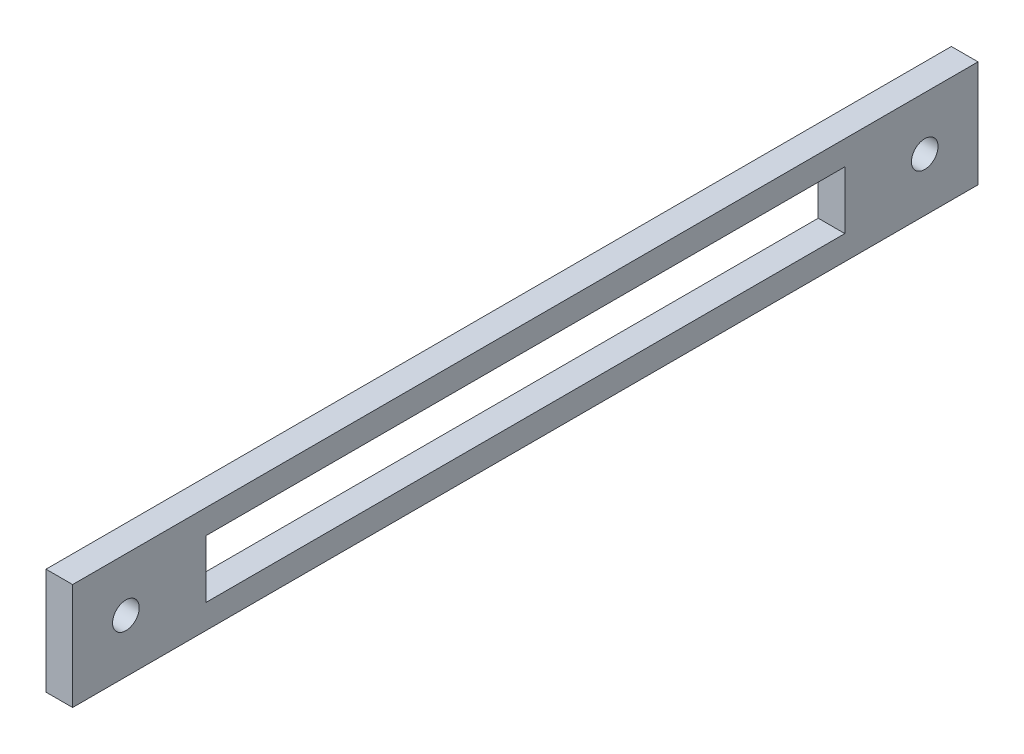
ISO-10303-21;
HEADER;
FILE_DESCRIPTION(('STEP AP214'),'2;1');
FILE_NAME('part.step','',(''),(''),'','','');
FILE_SCHEMA(('AUTOMOTIVE_DESIGN { 1 0 10303 214 1 1 1 1 }'));
ENDSEC;
DATA;
#1=APPLICATION_CONTEXT('core data for automotive mechanical design processes');
#2=APPLICATION_PROTOCOL_DEFINITION('international standard','automotive_design',2000,#1);
#3=PRODUCT_CONTEXT('',#1,'mechanical');
#4=PRODUCT('Part','Part','',(#3));
#5=PRODUCT_RELATED_PRODUCT_CATEGORY('part','',(#4));
#6=PRODUCT_DEFINITION_FORMATION('','',#4);
#7=PRODUCT_DEFINITION_CONTEXT('part definition',#1,'design');
#8=PRODUCT_DEFINITION('design','',#6,#7);
#9=PRODUCT_DEFINITION_SHAPE('','',#8);
#10=(LENGTH_UNIT() NAMED_UNIT(*) SI_UNIT(.MILLI.,.METRE.));
#11=(NAMED_UNIT(*) PLANE_ANGLE_UNIT() SI_UNIT($,.RADIAN.));
#12=(NAMED_UNIT(*) SI_UNIT($,.STERADIAN.) SOLID_ANGLE_UNIT());
#13=UNCERTAINTY_MEASURE_WITH_UNIT(LENGTH_MEASURE(1.E-05),#10,'distance_accuracy_value','');
#14=(GEOMETRIC_REPRESENTATION_CONTEXT(3) GLOBAL_UNCERTAINTY_ASSIGNED_CONTEXT((#13)) GLOBAL_UNIT_ASSIGNED_CONTEXT((#10,
#11,#12)) REPRESENTATION_CONTEXT('',''));
#15=CARTESIAN_POINT('',(0.,0.,0.));
#16=DIRECTION('',(0.,0.,1.));
#17=DIRECTION('',(1.,0.,0.));
#18=AXIS2_PLACEMENT_3D('',#15,#16,#17);
#19=CARTESIAN_POINT('',(10.,10.8586178819304,0.));
#20=DIRECTION('',(0.,1.,0.));
#21=DIRECTION('',(0.,0.,1.));
#22=AXIS2_PLACEMENT_3D('',#19,#20,#21);
#23=PLANE('',#22);
#24=DIRECTION('',(0.,0.,-1.));
#25=VECTOR('',#24,1.);
#26=CARTESIAN_POINT('',(0.,10.8586178819304,0.));
#27=LINE('',#26,#25);
#28=CARTESIAN_POINT('',(0.,10.8586178819304,120.));
#29=VERTEX_POINT('',#28);
#30=CARTESIAN_POINT('',(0.,10.8586178819304,-120.));
#31=VERTEX_POINT('',#30);
#32=EDGE_CURVE('E151',#29,#31,#27,.T.);
#33=ORIENTED_EDGE('',*,*,#32,.T.);
#34=DIRECTION('',(-1.,0.,0.));
#35=VECTOR('',#34,1.);
#36=CARTESIAN_POINT('',(10.,10.8586178819304,-120.));
#37=LINE('',#36,#35);
#38=CARTESIAN_POINT('',(10.,10.8586178819304,-120.));
#39=VERTEX_POINT('',#38);
#40=EDGE_CURVE('E11',#39,#31,#37,.T.);
#41=ORIENTED_EDGE('',*,*,#40,.F.);
#42=DIRECTION('',(0.,0.,-1.));
#43=VECTOR('',#42,1.);
#44=CARTESIAN_POINT('',(10.,10.8586178819304,0.));
#45=LINE('',#44,#43);
#46=CARTESIAN_POINT('',(10.,10.8586178819304,120.));
#47=VERTEX_POINT('',#46);
#48=EDGE_CURVE('E116',#47,#39,#45,.T.);
#49=ORIENTED_EDGE('',*,*,#48,.F.);
#50=DIRECTION('',(-1.,0.,0.));
#51=VECTOR('',#50,1.);
#52=CARTESIAN_POINT('',(10.,10.8586178819304,120.));
#53=LINE('',#52,#51);
#54=EDGE_CURVE('E56',#47,#29,#53,.T.);
#55=ORIENTED_EDGE('',*,*,#54,.T.);
#56=EDGE_LOOP('',(#33,#41,#49,#55));
#57=FACE_BOUND('',#56,.T.);
#58=ADVANCED_FACE('F37',(#57),#23,.F.);
#59=CARTESIAN_POINT('',(10.,0.,-120.));
#60=DIRECTION('',(0.,0.,-1.));
#61=DIRECTION('',(-1.,0.,0.));
#62=AXIS2_PLACEMENT_3D('',#59,#60,#61);
#63=PLANE('',#62);
#64=DIRECTION('',(0.,-1.,0.));
#65=VECTOR('',#64,1.);
#66=CARTESIAN_POINT('',(0.,0.,-120.));
#67=LINE('',#66,#65);
#68=CARTESIAN_POINT('',(0.,-10.8586178819304,-120.));
#69=VERTEX_POINT('',#68);
#70=EDGE_CURVE('E122',#31,#69,#67,.T.);
#71=ORIENTED_EDGE('',*,*,#70,.T.);
#72=DIRECTION('',(-1.,0.,0.));
#73=VECTOR('',#72,1.);
#74=CARTESIAN_POINT('',(10.,-10.8586178819304,-120.));
#75=LINE('',#74,#73);
#76=CARTESIAN_POINT('',(10.,-10.8586178819304,-120.));
#77=VERTEX_POINT('',#76);
#78=EDGE_CURVE('E47',#77,#69,#75,.T.);
#79=ORIENTED_EDGE('',*,*,#78,.F.);
#80=DIRECTION('',(0.,-1.,0.));
#81=VECTOR('',#80,1.);
#82=CARTESIAN_POINT('',(10.,0.,-120.));
#83=LINE('',#82,#81);
#84=EDGE_CURVE('E110',#39,#77,#83,.T.);
#85=ORIENTED_EDGE('',*,*,#84,.F.);
#86=ORIENTED_EDGE('',*,*,#40,.T.);
#87=EDGE_LOOP('',(#71,#79,#85,#86));
#88=FACE_BOUND('',#87,.T.);
#89=ADVANCED_FACE('F121',(#88),#63,.F.);
#90=CARTESIAN_POINT('',(10.,-10.8586178819304,0.));
#91=DIRECTION('',(0.,1.,0.));
#92=DIRECTION('',(0.,0.,1.));
#93=AXIS2_PLACEMENT_3D('',#90,#91,#92);
#94=PLANE('',#93);
#95=DIRECTION('',(0.,0.,-1.));
#96=VECTOR('',#95,1.);
#97=CARTESIAN_POINT('',(0.,-10.8586178819304,0.));
#98=LINE('',#97,#96);
#99=CARTESIAN_POINT('',(0.,-10.8586178819304,120.));
#100=VERTEX_POINT('',#99);
#101=EDGE_CURVE('E154',#100,#69,#98,.T.);
#102=ORIENTED_EDGE('',*,*,#101,.F.);
#103=DIRECTION('',(-1.,0.,0.));
#104=VECTOR('',#103,1.);
#105=CARTESIAN_POINT('',(10.,-10.8586178819304,120.));
#106=LINE('',#105,#104);
#107=CARTESIAN_POINT('',(10.,-10.8586178819304,120.));
#108=VERTEX_POINT('',#107);
#109=EDGE_CURVE('E82',#108,#100,#106,.T.);
#110=ORIENTED_EDGE('',*,*,#109,.F.);
#111=DIRECTION('',(0.,0.,-1.));
#112=VECTOR('',#111,1.);
#113=CARTESIAN_POINT('',(10.,-10.8586178819304,0.));
#114=LINE('',#113,#112);
#115=EDGE_CURVE('E115',#108,#77,#114,.T.);
#116=ORIENTED_EDGE('',*,*,#115,.T.);
#117=ORIENTED_EDGE('',*,*,#78,.T.);
#118=EDGE_LOOP('',(#102,#110,#116,#117));
#119=FACE_BOUND('',#118,.T.);
#120=ADVANCED_FACE('F126',(#119),#94,.T.);
#121=CARTESIAN_POINT('',(10.,0.,-170.));
#122=DIRECTION('',(0.,0.,-1.));
#123=DIRECTION('',(-1.,0.,0.));
#124=AXIS2_PLACEMENT_3D('',#121,#122,#123);
#125=PLANE('',#124);
#126=DIRECTION('',(0.,-1.,0.));
#127=VECTOR('',#126,1.);
#128=CARTESIAN_POINT('',(0.,0.,-170.));
#129=LINE('',#128,#127);
#130=CARTESIAN_POINT('',(0.,20.,-170.));
#131=VERTEX_POINT('',#130);
#132=CARTESIAN_POINT('',(0.,-20.,-170.));
#133=VERTEX_POINT('',#132);
#134=EDGE_CURVE('E139',#131,#133,#129,.T.);
#135=ORIENTED_EDGE('',*,*,#134,.F.);
#136=DIRECTION('',(-1.,0.,0.));
#137=VECTOR('',#136,1.);
#138=CARTESIAN_POINT('',(10.,20.,-170.));
#139=LINE('',#138,#137);
#140=CARTESIAN_POINT('',(10.,20.,-170.));
#141=VERTEX_POINT('',#140);
#142=EDGE_CURVE('E41',#141,#131,#139,.T.);
#143=ORIENTED_EDGE('',*,*,#142,.F.);
#144=DIRECTION('',(0.,-1.,0.));
#145=VECTOR('',#144,1.);
#146=CARTESIAN_POINT('',(10.,0.,-170.));
#147=LINE('',#146,#145);
#148=CARTESIAN_POINT('',(10.,-20.,-170.));
#149=VERTEX_POINT('',#148);
#150=EDGE_CURVE('E190',#141,#149,#147,.T.);
#151=ORIENTED_EDGE('',*,*,#150,.T.);
#152=DIRECTION('',(-1.,0.,0.));
#153=VECTOR('',#152,1.);
#154=CARTESIAN_POINT('',(10.,-20.,-170.));
#155=LINE('',#154,#153);
#156=EDGE_CURVE('E129',#149,#133,#155,.T.);
#157=ORIENTED_EDGE('',*,*,#156,.T.);
#158=EDGE_LOOP('',(#135,#143,#151,#157));
#159=FACE_BOUND('',#158,.T.);
#160=ADVANCED_FACE('F175',(#159),#125,.T.);
#161=CARTESIAN_POINT('',(10.,20.,0.));
#162=DIRECTION('',(0.,1.,0.));
#163=DIRECTION('',(0.,0.,1.));
#164=AXIS2_PLACEMENT_3D('',#161,#162,#163);
#165=PLANE('',#164);
#166=DIRECTION('',(0.,0.,-1.));
#167=VECTOR('',#166,1.);
#168=CARTESIAN_POINT('',(0.,20.,0.));
#169=LINE('',#168,#167);
#170=CARTESIAN_POINT('',(0.,20.,170.));
#171=VERTEX_POINT('',#170);
#172=EDGE_CURVE('E142',#171,#131,#169,.T.);
#173=ORIENTED_EDGE('',*,*,#172,.F.);
#174=DIRECTION('',(-1.,0.,0.));
#175=VECTOR('',#174,1.);
#176=CARTESIAN_POINT('',(10.,20.,170.));
#177=LINE('',#176,#175);
#178=CARTESIAN_POINT('',(10.,20.,170.));
#179=VERTEX_POINT('',#178);
#180=EDGE_CURVE('E165',#179,#171,#177,.T.);
#181=ORIENTED_EDGE('',*,*,#180,.F.);
#182=DIRECTION('',(0.,0.,-1.));
#183=VECTOR('',#182,1.);
#184=CARTESIAN_POINT('',(10.,20.,0.));
#185=LINE('',#184,#183);
#186=EDGE_CURVE('E174',#179,#141,#185,.T.);
#187=ORIENTED_EDGE('',*,*,#186,.T.);
#188=ORIENTED_EDGE('',*,*,#142,.T.);
#189=EDGE_LOOP('',(#173,#181,#187,#188));
#190=FACE_BOUND('',#189,.T.);
#191=ADVANCED_FACE('F172',(#190),#165,.T.);
#192=CARTESIAN_POINT('',(10.,0.,170.));
#193=DIRECTION('',(0.,0.,-1.));
#194=DIRECTION('',(-1.,0.,0.));
#195=AXIS2_PLACEMENT_3D('',#192,#193,#194);
#196=PLANE('',#195);
#197=DIRECTION('',(0.,-1.,0.));
#198=VECTOR('',#197,1.);
#199=CARTESIAN_POINT('',(0.,0.,170.));
#200=LINE('',#199,#198);
#201=CARTESIAN_POINT('',(0.,-20.,170.));
#202=VERTEX_POINT('',#201);
#203=EDGE_CURVE('E145',#171,#202,#200,.T.);
#204=ORIENTED_EDGE('',*,*,#203,.T.);
#205=DIRECTION('',(-1.,0.,0.));
#206=VECTOR('',#205,1.);
#207=CARTESIAN_POINT('',(10.,-20.,170.));
#208=LINE('',#207,#206);
#209=CARTESIAN_POINT('',(10.,-20.,170.));
#210=VERTEX_POINT('',#209);
#211=EDGE_CURVE('E163',#210,#202,#208,.T.);
#212=ORIENTED_EDGE('',*,*,#211,.F.);
#213=DIRECTION('',(0.,-1.,0.));
#214=VECTOR('',#213,1.);
#215=CARTESIAN_POINT('',(10.,0.,170.));
#216=LINE('',#215,#214);
#217=EDGE_CURVE('E183',#179,#210,#216,.T.);
#218=ORIENTED_EDGE('',*,*,#217,.F.);
#219=ORIENTED_EDGE('',*,*,#180,.T.);
#220=EDGE_LOOP('',(#204,#212,#218,#219));
#221=FACE_BOUND('',#220,.T.);
#222=ADVANCED_FACE('F181',(#221),#196,.F.);
#223=CARTESIAN_POINT('',(10.,-20.,0.));
#224=DIRECTION('',(0.,1.,0.));
#225=DIRECTION('',(0.,0.,1.));
#226=AXIS2_PLACEMENT_3D('',#223,#224,#225);
#227=PLANE('',#226);
#228=DIRECTION('',(0.,0.,-1.));
#229=VECTOR('',#228,1.);
#230=CARTESIAN_POINT('',(0.,-20.,0.));
#231=LINE('',#230,#229);
#232=EDGE_CURVE('E148',#202,#133,#231,.T.);
#233=ORIENTED_EDGE('',*,*,#232,.T.);
#234=ORIENTED_EDGE('',*,*,#156,.F.);
#235=DIRECTION('',(0.,0.,-1.));
#236=VECTOR('',#235,1.);
#237=CARTESIAN_POINT('',(10.,-20.,0.));
#238=LINE('',#237,#236);
#239=EDGE_CURVE('E186',#210,#149,#238,.T.);
#240=ORIENTED_EDGE('',*,*,#239,.F.);
#241=ORIENTED_EDGE('',*,*,#211,.T.);
#242=EDGE_LOOP('',(#233,#234,#240,#241));
#243=FACE_BOUND('',#242,.T.);
#244=ADVANCED_FACE('F185',(#243),#227,.F.);
#245=CARTESIAN_POINT('',(10.,0.,150.));
#246=DIRECTION('',(-1.,0.,0.));
#247=DIRECTION('',(0.,0.,1.));
#248=AXIS2_PLACEMENT_3D('',#245,#246,#247);
#249=CYLINDRICAL_SURFACE('',#248,5.00000000000005);
#250=CARTESIAN_POINT('',(10.,0.,150.));
#251=DIRECTION('',(1.,0.,0.));
#252=DIRECTION('',(0.,0.,-1.));
#253=AXIS2_PLACEMENT_3D('',#250,#251,#252);
#254=CIRCLE('',#253,5.00000000000005);
#255=CARTESIAN_POINT('',(10.,0.,145.));
#256=VERTEX_POINT('',#255);
#257=EDGE_CURVE('E194',#256,#256,#254,.T.);
#258=ORIENTED_EDGE('',*,*,#257,.T.);
#259=EDGE_LOOP('',(#258));
#260=FACE_BOUND('',#259,.T.);
#261=CARTESIAN_POINT('',(0.,0.,150.));
#262=DIRECTION('',(1.,0.,0.));
#263=DIRECTION('',(0.,0.,-1.));
#264=AXIS2_PLACEMENT_3D('',#261,#262,#263);
#265=CIRCLE('',#264,5.00000000000005);
#266=CARTESIAN_POINT('',(0.,0.,145.));
#267=VERTEX_POINT('',#266);
#268=EDGE_CURVE('E136',#267,#267,#265,.T.);
#269=ORIENTED_EDGE('',*,*,#268,.F.);
#270=EDGE_LOOP('',(#269));
#271=FACE_BOUND('',#270,.T.);
#272=ADVANCED_FACE('F208',(#260,#271),#249,.F.);
#273=CARTESIAN_POINT('',(10.,0.,-150.));
#274=DIRECTION('',(-1.,0.,0.));
#275=DIRECTION('',(0.,0.,1.));
#276=AXIS2_PLACEMENT_3D('',#273,#274,#275);
#277=CYLINDRICAL_SURFACE('',#276,4.99999999999999);
#278=CARTESIAN_POINT('',(10.,0.,-150.));
#279=DIRECTION('',(1.,0.,0.));
#280=DIRECTION('',(0.,0.,-1.));
#281=AXIS2_PLACEMENT_3D('',#278,#279,#280);
#282=CIRCLE('',#281,4.99999999999999);
#283=CARTESIAN_POINT('',(10.,0.,-155.));
#284=VERTEX_POINT('',#283);
#285=EDGE_CURVE('E159',#284,#284,#282,.T.);
#286=ORIENTED_EDGE('',*,*,#285,.T.);
#287=EDGE_LOOP('',(#286));
#288=FACE_BOUND('',#287,.T.);
#289=CARTESIAN_POINT('',(0.,0.,-150.));
#290=DIRECTION('',(1.,0.,0.));
#291=DIRECTION('',(0.,0.,-1.));
#292=AXIS2_PLACEMENT_3D('',#289,#290,#291);
#293=CIRCLE('',#292,4.99999999999999);
#294=CARTESIAN_POINT('',(0.,0.,-155.));
#295=VERTEX_POINT('',#294);
#296=EDGE_CURVE('E133',#295,#295,#293,.T.);
#297=ORIENTED_EDGE('',*,*,#296,.F.);
#298=EDGE_LOOP('',(#297));
#299=FACE_BOUND('',#298,.T.);
#300=ADVANCED_FACE('F39',(#288,#299),#277,.F.);
#301=CARTESIAN_POINT('',(10.,0.,120.));
#302=DIRECTION('',(0.,0.,-1.));
#303=DIRECTION('',(-1.,0.,0.));
#304=AXIS2_PLACEMENT_3D('',#301,#302,#303);
#305=PLANE('',#304);
#306=DIRECTION('',(0.,-1.,0.));
#307=VECTOR('',#306,1.);
#308=CARTESIAN_POINT('',(0.,0.,120.));
#309=LINE('',#308,#307);
#310=EDGE_CURVE('E156',#29,#100,#309,.T.);
#311=ORIENTED_EDGE('',*,*,#310,.F.);
#312=ORIENTED_EDGE('',*,*,#54,.F.);
#313=DIRECTION('',(0.,-1.,0.));
#314=VECTOR('',#313,1.);
#315=CARTESIAN_POINT('',(10.,0.,120.));
#316=LINE('',#315,#314);
#317=EDGE_CURVE('E127',#47,#108,#316,.T.);
#318=ORIENTED_EDGE('',*,*,#317,.T.);
#319=ORIENTED_EDGE('',*,*,#109,.T.);
#320=EDGE_LOOP('',(#311,#312,#318,#319));
#321=FACE_BOUND('',#320,.T.);
#322=ADVANCED_FACE('F204',(#321),#305,.T.);
#323=CARTESIAN_POINT('',(10.,0.,0.));
#324=DIRECTION('',(1.,0.,0.));
#325=DIRECTION('',(0.,0.,-1.));
#326=AXIS2_PLACEMENT_3D('',#323,#324,#325);
#327=PLANE('',#326);
#328=ORIENTED_EDGE('',*,*,#285,.F.);
#329=EDGE_LOOP('',(#328));
#330=FACE_BOUND('',#329,.T.);
#331=ORIENTED_EDGE('',*,*,#257,.F.);
#332=EDGE_LOOP('',(#331));
#333=FACE_BOUND('',#332,.T.);
#334=ORIENTED_EDGE('',*,*,#150,.F.);
#335=ORIENTED_EDGE('',*,*,#186,.F.);
#336=ORIENTED_EDGE('',*,*,#217,.T.);
#337=ORIENTED_EDGE('',*,*,#239,.T.);
#338=EDGE_LOOP('',(#334,#335,#336,#337));
#339=FACE_BOUND('',#338,.T.);
#340=ORIENTED_EDGE('',*,*,#48,.T.);
#341=ORIENTED_EDGE('',*,*,#84,.T.);
#342=ORIENTED_EDGE('',*,*,#115,.F.);
#343=ORIENTED_EDGE('',*,*,#317,.F.);
#344=EDGE_LOOP('',(#340,#341,#342,#343));
#345=FACE_BOUND('',#344,.T.);
#346=ADVANCED_FACE('F112',(#330,#333,#339,#345),#327,.T.);
#347=CARTESIAN_POINT('',(0.,0.,0.));
#348=DIRECTION('',(1.,0.,0.));
#349=DIRECTION('',(0.,0.,-1.));
#350=AXIS2_PLACEMENT_3D('',#347,#348,#349);
#351=PLANE('',#350);
#352=ORIENTED_EDGE('',*,*,#296,.T.);
#353=EDGE_LOOP('',(#352));
#354=FACE_BOUND('',#353,.T.);
#355=ORIENTED_EDGE('',*,*,#268,.T.);
#356=EDGE_LOOP('',(#355));
#357=FACE_BOUND('',#356,.T.);
#358=ORIENTED_EDGE('',*,*,#134,.T.);
#359=ORIENTED_EDGE('',*,*,#232,.F.);
#360=ORIENTED_EDGE('',*,*,#203,.F.);
#361=ORIENTED_EDGE('',*,*,#172,.T.);
#362=EDGE_LOOP('',(#358,#359,#360,#361));
#363=FACE_BOUND('',#362,.T.);
#364=ORIENTED_EDGE('',*,*,#32,.F.);
#365=ORIENTED_EDGE('',*,*,#310,.T.);
#366=ORIENTED_EDGE('',*,*,#101,.T.);
#367=ORIENTED_EDGE('',*,*,#70,.F.);
#368=EDGE_LOOP('',(#364,#365,#366,#367));
#369=FACE_BOUND('',#368,.T.);
#370=ADVANCED_FACE('F178',(#354,#357,#363,#369),#351,.F.);
#371=CLOSED_SHELL('',(#58,#89,#120,#160,#191,#222,#244,#272,#300,#322,#346,#370));
#372=MANIFOLD_SOLID_BREP('B2',#371);
#373=ADVANCED_BREP_SHAPE_REPRESENTATION('',(#18,#372),#14);
#374=SHAPE_DEFINITION_REPRESENTATION(#9,#373);
ENDSEC;
END-ISO-10303-21;
